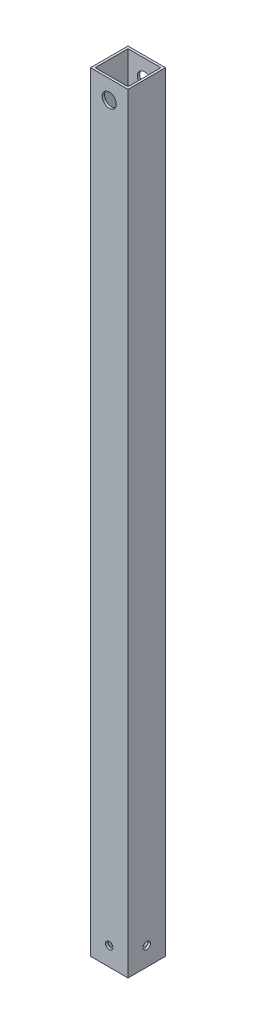
ISO-10303-21;
HEADER;
FILE_DESCRIPTION(('STEP AP214'),'2;1');
FILE_NAME('part.step','',(''),(''),'','','');
FILE_SCHEMA(('AUTOMOTIVE_DESIGN { 1 0 10303 214 1 1 1 1 }'));
ENDSEC;
DATA;
#1=APPLICATION_CONTEXT('core data for automotive mechanical design processes');
#2=APPLICATION_PROTOCOL_DEFINITION('international standard','automotive_design',2000,#1);
#3=PRODUCT_CONTEXT('',#1,'mechanical');
#4=PRODUCT('Part','Part','',(#3));
#5=PRODUCT_RELATED_PRODUCT_CATEGORY('part','',(#4));
#6=PRODUCT_DEFINITION_FORMATION('','',#4);
#7=PRODUCT_DEFINITION_CONTEXT('part definition',#1,'design');
#8=PRODUCT_DEFINITION('design','',#6,#7);
#9=PRODUCT_DEFINITION_SHAPE('','',#8);
#10=(LENGTH_UNIT() NAMED_UNIT(*) SI_UNIT(.MILLI.,.METRE.));
#11=(NAMED_UNIT(*) PLANE_ANGLE_UNIT() SI_UNIT($,.RADIAN.));
#12=(NAMED_UNIT(*) SI_UNIT($,.STERADIAN.) SOLID_ANGLE_UNIT());
#13=UNCERTAINTY_MEASURE_WITH_UNIT(LENGTH_MEASURE(1.E-05),#10,'distance_accuracy_value','');
#14=(GEOMETRIC_REPRESENTATION_CONTEXT(3) GLOBAL_UNCERTAINTY_ASSIGNED_CONTEXT((#13)) GLOBAL_UNIT_ASSIGNED_CONTEXT((#10,
#11,#12)) REPRESENTATION_CONTEXT('',''));
#15=CARTESIAN_POINT('',(0.,0.,0.));
#16=DIRECTION('',(0.,0.,1.));
#17=DIRECTION('',(1.,0.,0.));
#18=AXIS2_PLACEMENT_3D('',#15,#16,#17);
#19=CARTESIAN_POINT('',(-12.7,-247.65,0.));
#20=DIRECTION('',(1.,0.,0.));
#21=DIRECTION('',(0.,0.,-1.));
#22=AXIS2_PLACEMENT_3D('',#19,#20,#21);
#23=CYLINDRICAL_SURFACE('',#22,2.4892);
#24=DIRECTION('',(1.,0.,0.));
#25=VECTOR('',#24,1.);
#26=CARTESIAN_POINT('',(-12.7,-247.65,2.4892));
#27=LINE('',#26,#25);
#28=CARTESIAN_POINT('',(11.1125,-247.65,2.4892));
#29=VERTEX_POINT('',#28);
#30=CARTESIAN_POINT('',(12.7,-247.65,2.4892));
#31=VERTEX_POINT('',#30);
#32=EDGE_CURVE('E142',#29,#31,#27,.T.);
#33=ORIENTED_EDGE('',*,*,#32,.F.);
#34=CARTESIAN_POINT('',(11.1125,-247.65,0.));
#35=DIRECTION('',(-1.,0.,0.));
#36=DIRECTION('',(0.,0.,1.));
#37=AXIS2_PLACEMENT_3D('',#34,#35,#36);
#38=CIRCLE('',#37,2.4892);
#39=CARTESIAN_POINT('',(11.1125,-247.65,-2.4892));
#40=VERTEX_POINT('',#39);
#41=EDGE_CURVE('E132',#29,#40,#38,.T.);
#42=ORIENTED_EDGE('',*,*,#41,.T.);
#43=DIRECTION('',(1.,0.,0.));
#44=VECTOR('',#43,1.);
#45=CARTESIAN_POINT('',(-12.7,-247.65,-2.4892));
#46=LINE('',#45,#44);
#47=CARTESIAN_POINT('',(12.7,-247.65,-2.4892));
#48=VERTEX_POINT('',#47);
#49=EDGE_CURVE('E163',#40,#48,#46,.T.);
#50=ORIENTED_EDGE('',*,*,#49,.T.);
#51=CARTESIAN_POINT('',(12.7,-247.65,0.));
#52=DIRECTION('',(1.,0.,0.));
#53=DIRECTION('',(0.,0.,-1.));
#54=AXIS2_PLACEMENT_3D('',#51,#52,#53);
#55=CIRCLE('',#54,2.4892);
#56=EDGE_CURVE('E233',#48,#31,#55,.T.);
#57=ORIENTED_EDGE('',*,*,#56,.T.);
#58=EDGE_LOOP('',(#33,#42,#50,#57));
#59=FACE_BOUND('',#58,.T.);
#60=ADVANCED_FACE('F17',(#59),#23,.F.);
#61=CARTESIAN_POINT('',(-12.7,-247.65,0.));
#62=DIRECTION('',(1.,0.,0.));
#63=DIRECTION('',(0.,0.,-1.));
#64=AXIS2_PLACEMENT_3D('',#61,#62,#63);
#65=CYLINDRICAL_SURFACE('',#64,2.4892);
#66=DIRECTION('',(1.,0.,0.));
#67=VECTOR('',#66,1.);
#68=CARTESIAN_POINT('',(-12.7,-247.65,2.4892));
#69=LINE('',#68,#67);
#70=CARTESIAN_POINT('',(-12.7,-247.65,2.4892));
#71=VERTEX_POINT('',#70);
#72=CARTESIAN_POINT('',(-11.1125,-247.65,2.4892));
#73=VERTEX_POINT('',#72);
#74=EDGE_CURVE('E162',#71,#73,#69,.T.);
#75=ORIENTED_EDGE('',*,*,#74,.F.);
#76=CARTESIAN_POINT('',(-12.7,-247.65,0.));
#77=DIRECTION('',(1.,0.,0.));
#78=DIRECTION('',(0.,0.,-1.));
#79=AXIS2_PLACEMENT_3D('',#76,#77,#78);
#80=CIRCLE('',#79,2.4892);
#81=CARTESIAN_POINT('',(-12.7,-247.65,-2.4892));
#82=VERTEX_POINT('',#81);
#83=EDGE_CURVE('E219',#82,#71,#80,.T.);
#84=ORIENTED_EDGE('',*,*,#83,.F.);
#85=DIRECTION('',(1.,0.,0.));
#86=VECTOR('',#85,1.);
#87=CARTESIAN_POINT('',(-12.7,-247.65,-2.4892));
#88=LINE('',#87,#86);
#89=CARTESIAN_POINT('',(-11.1125,-247.65,-2.4892));
#90=VERTEX_POINT('',#89);
#91=EDGE_CURVE('E164',#82,#90,#88,.T.);
#92=ORIENTED_EDGE('',*,*,#91,.T.);
#93=CARTESIAN_POINT('',(-11.1125,-247.65,0.));
#94=DIRECTION('',(1.,0.,0.));
#95=DIRECTION('',(0.,0.,-1.));
#96=AXIS2_PLACEMENT_3D('',#93,#94,#95);
#97=CIRCLE('',#96,2.4892);
#98=EDGE_CURVE('E157',#90,#73,#97,.T.);
#99=ORIENTED_EDGE('',*,*,#98,.T.);
#100=EDGE_LOOP('',(#75,#84,#92,#99));
#101=FACE_BOUND('',#100,.T.);
#102=ADVANCED_FACE('F448',(#101),#65,.F.);
#103=CARTESIAN_POINT('',(0.,-247.65,-12.7));
#104=DIRECTION('',(0.,0.,1.));
#105=DIRECTION('',(1.,0.,0.));
#106=AXIS2_PLACEMENT_3D('',#103,#104,#105);
#107=CYLINDRICAL_SURFACE('',#106,2.4892);
#108=DIRECTION('',(0.,0.,1.));
#109=VECTOR('',#108,1.);
#110=CARTESIAN_POINT('',(-2.4892,-247.65,-12.7));
#111=LINE('',#110,#109);
#112=CARTESIAN_POINT('',(-2.4892,-247.65,-12.7));
#113=VERTEX_POINT('',#112);
#114=CARTESIAN_POINT('',(-2.4892,-247.65,-11.1125));
#115=VERTEX_POINT('',#114);
#116=EDGE_CURVE('E185',#113,#115,#111,.T.);
#117=ORIENTED_EDGE('',*,*,#116,.F.);
#118=CARTESIAN_POINT('',(0.,-247.65,-12.7));
#119=DIRECTION('',(0.,0.,1.));
#120=DIRECTION('',(1.,0.,0.));
#121=AXIS2_PLACEMENT_3D('',#118,#119,#120);
#122=CIRCLE('',#121,2.4892);
#123=CARTESIAN_POINT('',(2.4892,-247.65,-12.7));
#124=VERTEX_POINT('',#123);
#125=EDGE_CURVE('E104',#124,#113,#122,.T.);
#126=ORIENTED_EDGE('',*,*,#125,.F.);
#127=DIRECTION('',(0.,0.,1.));
#128=VECTOR('',#127,1.);
#129=CARTESIAN_POINT('',(2.4892,-247.65,-12.7));
#130=LINE('',#129,#128);
#131=CARTESIAN_POINT('',(2.4892,-247.65,-11.1125));
#132=VERTEX_POINT('',#131);
#133=EDGE_CURVE('E119',#124,#132,#130,.T.);
#134=ORIENTED_EDGE('',*,*,#133,.T.);
#135=CARTESIAN_POINT('',(0.,-247.65,-11.1125));
#136=DIRECTION('',(0.,0.,1.));
#137=DIRECTION('',(1.,0.,0.));
#138=AXIS2_PLACEMENT_3D('',#135,#136,#137);
#139=CIRCLE('',#138,2.4892);
#140=EDGE_CURVE('E179',#132,#115,#139,.T.);
#141=ORIENTED_EDGE('',*,*,#140,.T.);
#142=EDGE_LOOP('',(#117,#126,#134,#141));
#143=FACE_BOUND('',#142,.T.);
#144=ADVANCED_FACE('F477',(#143),#107,.F.);
#145=CARTESIAN_POINT('',(0.,247.65,-12.7));
#146=DIRECTION('',(0.,0.,1.));
#147=DIRECTION('',(1.,0.,0.));
#148=AXIS2_PLACEMENT_3D('',#145,#146,#147);
#149=CYLINDRICAL_SURFACE('',#148,4.7625);
#150=DIRECTION('',(0.,0.,1.));
#151=VECTOR('',#150,1.);
#152=CARTESIAN_POINT('',(-4.7625,247.65,-12.7));
#153=LINE('',#152,#151);
#154=CARTESIAN_POINT('',(-4.7625,247.65,-12.7));
#155=VERTEX_POINT('',#154);
#156=CARTESIAN_POINT('',(-4.7625,247.65,-11.1125));
#157=VERTEX_POINT('',#156);
#158=EDGE_CURVE('E108',#155,#157,#153,.T.);
#159=ORIENTED_EDGE('',*,*,#158,.F.);
#160=CARTESIAN_POINT('',(0.,247.65,-12.7));
#161=DIRECTION('',(0.,0.,1.));
#162=DIRECTION('',(1.,0.,0.));
#163=AXIS2_PLACEMENT_3D('',#160,#161,#162);
#164=CIRCLE('',#163,4.7625);
#165=CARTESIAN_POINT('',(4.7625,247.65,-12.7));
#166=VERTEX_POINT('',#165);
#167=EDGE_CURVE('E93',#166,#155,#164,.T.);
#168=ORIENTED_EDGE('',*,*,#167,.F.);
#169=DIRECTION('',(0.,0.,1.));
#170=VECTOR('',#169,1.);
#171=CARTESIAN_POINT('',(4.7625,247.65,-12.7));
#172=LINE('',#171,#170);
#173=CARTESIAN_POINT('',(4.7625,247.65,-11.1125));
#174=VERTEX_POINT('',#173);
#175=EDGE_CURVE('E117',#166,#174,#172,.T.);
#176=ORIENTED_EDGE('',*,*,#175,.T.);
#177=CARTESIAN_POINT('',(0.,247.65,-11.1125));
#178=DIRECTION('',(0.,0.,1.));
#179=DIRECTION('',(1.,0.,0.));
#180=AXIS2_PLACEMENT_3D('',#177,#178,#179);
#181=CIRCLE('',#180,4.7625);
#182=EDGE_CURVE('E109',#174,#157,#181,.T.);
#183=ORIENTED_EDGE('',*,*,#182,.T.);
#184=EDGE_LOOP('',(#159,#168,#176,#183));
#185=FACE_BOUND('',#184,.T.);
#186=ADVANCED_FACE('F19',(#185),#149,.F.);
#187=CARTESIAN_POINT('',(0.,-247.65,-12.7));
#188=DIRECTION('',(0.,0.,1.));
#189=DIRECTION('',(1.,0.,0.));
#190=AXIS2_PLACEMENT_3D('',#187,#188,#189);
#191=CYLINDRICAL_SURFACE('',#190,2.4892);
#192=DIRECTION('',(0.,0.,1.));
#193=VECTOR('',#192,1.);
#194=CARTESIAN_POINT('',(-2.4892,-247.65,-12.7));
#195=LINE('',#194,#193);
#196=CARTESIAN_POINT('',(-2.4892,-247.65,11.1125));
#197=VERTEX_POINT('',#196);
#198=CARTESIAN_POINT('',(-2.4892,-247.65,12.7));
#199=VERTEX_POINT('',#198);
#200=EDGE_CURVE('E305',#197,#199,#195,.T.);
#201=ORIENTED_EDGE('',*,*,#200,.F.);
#202=CARTESIAN_POINT('',(0.,-247.65,11.1125));
#203=DIRECTION('',(0.,0.,-1.));
#204=DIRECTION('',(-1.,0.,0.));
#205=AXIS2_PLACEMENT_3D('',#202,#203,#204);
#206=CIRCLE('',#205,2.4892);
#207=CARTESIAN_POINT('',(2.4892,-247.65,11.1125));
#208=VERTEX_POINT('',#207);
#209=EDGE_CURVE('E28',#197,#208,#206,.T.);
#210=ORIENTED_EDGE('',*,*,#209,.T.);
#211=DIRECTION('',(0.,0.,1.));
#212=VECTOR('',#211,1.);
#213=CARTESIAN_POINT('',(2.4892,-247.65,-12.7));
#214=LINE('',#213,#212);
#215=CARTESIAN_POINT('',(2.4892,-247.65,12.7));
#216=VERTEX_POINT('',#215);
#217=EDGE_CURVE('E200',#208,#216,#214,.T.);
#218=ORIENTED_EDGE('',*,*,#217,.T.);
#219=CARTESIAN_POINT('',(0.,-247.65,12.7));
#220=DIRECTION('',(0.,0.,-1.));
#221=DIRECTION('',(-1.,0.,0.));
#222=AXIS2_PLACEMENT_3D('',#219,#220,#221);
#223=CIRCLE('',#222,2.4892);
#224=EDGE_CURVE('E220',#199,#216,#223,.T.);
#225=ORIENTED_EDGE('',*,*,#224,.F.);
#226=EDGE_LOOP('',(#201,#210,#218,#225));
#227=FACE_BOUND('',#226,.T.);
#228=ADVANCED_FACE('F525',(#227),#191,.F.);
#229=CARTESIAN_POINT('',(0.,247.65,-12.7));
#230=DIRECTION('',(0.,0.,1.));
#231=DIRECTION('',(1.,0.,0.));
#232=AXIS2_PLACEMENT_3D('',#229,#230,#231);
#233=CYLINDRICAL_SURFACE('',#232,4.7625);
#234=DIRECTION('',(0.,0.,1.));
#235=VECTOR('',#234,1.);
#236=CARTESIAN_POINT('',(-4.7625,247.65,-12.7));
#237=LINE('',#236,#235);
#238=CARTESIAN_POINT('',(-4.7625,247.65,11.1125));
#239=VERTEX_POINT('',#238);
#240=CARTESIAN_POINT('',(-4.7625,247.65,12.7));
#241=VERTEX_POINT('',#240);
#242=EDGE_CURVE('E238',#239,#241,#237,.T.);
#243=ORIENTED_EDGE('',*,*,#242,.F.);
#244=CARTESIAN_POINT('',(0.,247.65,11.1125));
#245=DIRECTION('',(0.,0.,-1.));
#246=DIRECTION('',(-1.,0.,0.));
#247=AXIS2_PLACEMENT_3D('',#244,#245,#246);
#248=CIRCLE('',#247,4.7625);
#249=CARTESIAN_POINT('',(4.7625,247.65,11.1125));
#250=VERTEX_POINT('',#249);
#251=EDGE_CURVE('E11',#239,#250,#248,.T.);
#252=ORIENTED_EDGE('',*,*,#251,.T.);
#253=DIRECTION('',(0.,0.,1.));
#254=VECTOR('',#253,1.);
#255=CARTESIAN_POINT('',(4.7625,247.65,-12.7));
#256=LINE('',#255,#254);
#257=CARTESIAN_POINT('',(4.7625,247.65,12.7));
#258=VERTEX_POINT('',#257);
#259=EDGE_CURVE('E148',#250,#258,#256,.T.);
#260=ORIENTED_EDGE('',*,*,#259,.T.);
#261=CARTESIAN_POINT('',(0.,247.65,12.7));
#262=DIRECTION('',(0.,0.,-1.));
#263=DIRECTION('',(-1.,0.,0.));
#264=AXIS2_PLACEMENT_3D('',#261,#262,#263);
#265=CIRCLE('',#264,4.7625);
#266=EDGE_CURVE('E224',#241,#258,#265,.T.);
#267=ORIENTED_EDGE('',*,*,#266,.F.);
#268=EDGE_LOOP('',(#243,#252,#260,#267));
#269=FACE_BOUND('',#268,.T.);
#270=ADVANCED_FACE('F518',(#269),#233,.F.);
#271=CARTESIAN_POINT('',(0.,260.35,11.1125));
#272=DIRECTION('',(0.,0.,-1.));
#273=DIRECTION('',(-1.,0.,0.));
#274=AXIS2_PLACEMENT_3D('',#271,#272,#273);
#275=PLANE('',#274);
#276=CARTESIAN_POINT('',(0.,247.65,11.1125));
#277=DIRECTION('',(0.,0.,-1.));
#278=DIRECTION('',(-1.,0.,0.));
#279=AXIS2_PLACEMENT_3D('',#276,#277,#278);
#280=CIRCLE('',#279,4.7625);
#281=EDGE_CURVE('E204',#250,#239,#280,.T.);
#282=ORIENTED_EDGE('',*,*,#281,.F.);
#283=ORIENTED_EDGE('',*,*,#251,.F.);
#284=EDGE_LOOP('',(#282,#283));
#285=FACE_BOUND('',#284,.T.);
#286=CARTESIAN_POINT('',(0.,-247.65,11.1125));
#287=DIRECTION('',(0.,0.,-1.));
#288=DIRECTION('',(-1.,0.,0.));
#289=AXIS2_PLACEMENT_3D('',#286,#287,#288);
#290=CIRCLE('',#289,2.4892);
#291=EDGE_CURVE('E300',#208,#197,#290,.T.);
#292=ORIENTED_EDGE('',*,*,#291,.F.);
#293=ORIENTED_EDGE('',*,*,#209,.F.);
#294=EDGE_LOOP('',(#292,#293));
#295=FACE_BOUND('',#294,.T.);
#296=DIRECTION('',(1.,0.,0.));
#297=VECTOR('',#296,1.);
#298=CARTESIAN_POINT('',(0.,-260.35,11.1125));
#299=LINE('',#298,#297);
#300=CARTESIAN_POINT('',(-11.1125,-260.35,11.1125));
#301=VERTEX_POINT('',#300);
#302=CARTESIAN_POINT('',(11.1125,-260.35,11.1125));
#303=VERTEX_POINT('',#302);
#304=EDGE_CURVE('E177',#301,#303,#299,.T.);
#305=ORIENTED_EDGE('',*,*,#304,.F.);
#306=DIRECTION('',(0.,-1.,0.));
#307=VECTOR('',#306,1.);
#308=CARTESIAN_POINT('',(-11.1125,260.35,11.1125));
#309=LINE('',#308,#307);
#310=CARTESIAN_POINT('',(-11.1125,260.35,11.1125));
#311=VERTEX_POINT('',#310);
#312=EDGE_CURVE('E43',#311,#301,#309,.T.);
#313=ORIENTED_EDGE('',*,*,#312,.F.);
#314=DIRECTION('',(1.,0.,0.));
#315=VECTOR('',#314,1.);
#316=CARTESIAN_POINT('',(0.,260.35,11.1125));
#317=LINE('',#316,#315);
#318=CARTESIAN_POINT('',(11.1125,260.35,11.1125));
#319=VERTEX_POINT('',#318);
#320=EDGE_CURVE('E147',#311,#319,#317,.T.);
#321=ORIENTED_EDGE('',*,*,#320,.T.);
#322=DIRECTION('',(0.,-1.,0.));
#323=VECTOR('',#322,1.);
#324=CARTESIAN_POINT('',(11.1125,260.35,11.1125));
#325=LINE('',#324,#323);
#326=EDGE_CURVE('E225',#319,#303,#325,.T.);
#327=ORIENTED_EDGE('',*,*,#326,.T.);
#328=EDGE_LOOP('',(#305,#313,#321,#327));
#329=FACE_BOUND('',#328,.T.);
#330=ADVANCED_FACE('F504',(#285,#295,#329),#275,.T.);
#331=CARTESIAN_POINT('',(-11.1125,260.35,0.));
#332=DIRECTION('',(1.,0.,0.));
#333=DIRECTION('',(0.,0.,1.));
#334=AXIS2_PLACEMENT_3D('',#331,#332,#333);
#335=PLANE('',#334);
#336=ORIENTED_EDGE('',*,*,#98,.F.);
#337=CARTESIAN_POINT('',(-11.1125,-247.65,0.));
#338=DIRECTION('',(1.,0.,0.));
#339=DIRECTION('',(0.,0.,-1.));
#340=AXIS2_PLACEMENT_3D('',#337,#338,#339);
#341=CIRCLE('',#340,2.4892);
#342=EDGE_CURVE('E169',#73,#90,#341,.T.);
#343=ORIENTED_EDGE('',*,*,#342,.F.);
#344=EDGE_LOOP('',(#336,#343));
#345=FACE_BOUND('',#344,.T.);
#346=DIRECTION('',(0.,0.,1.));
#347=VECTOR('',#346,1.);
#348=CARTESIAN_POINT('',(-11.1125,-260.35,0.));
#349=LINE('',#348,#347);
#350=CARTESIAN_POINT('',(-11.1125,-260.35,-11.1125));
#351=VERTEX_POINT('',#350);
#352=EDGE_CURVE('E173',#351,#301,#349,.T.);
#353=ORIENTED_EDGE('',*,*,#352,.F.);
#354=DIRECTION('',(0.,-1.,0.));
#355=VECTOR('',#354,1.);
#356=CARTESIAN_POINT('',(-11.1125,260.35,-11.1125));
#357=LINE('',#356,#355);
#358=CARTESIAN_POINT('',(-11.1125,260.35,-11.1125));
#359=VERTEX_POINT('',#358);
#360=EDGE_CURVE('E136',#359,#351,#357,.T.);
#361=ORIENTED_EDGE('',*,*,#360,.F.);
#362=DIRECTION('',(0.,0.,1.));
#363=VECTOR('',#362,1.);
#364=CARTESIAN_POINT('',(-11.1125,260.35,0.));
#365=LINE('',#364,#363);
#366=EDGE_CURVE('E143',#359,#311,#365,.T.);
#367=ORIENTED_EDGE('',*,*,#366,.T.);
#368=ORIENTED_EDGE('',*,*,#312,.T.);
#369=EDGE_LOOP('',(#353,#361,#367,#368));
#370=FACE_BOUND('',#369,.T.);
#371=ADVANCED_FACE('F500',(#345,#370),#335,.T.);
#372=CARTESIAN_POINT('',(0.,260.35,-11.1125));
#373=DIRECTION('',(0.,0.,1.));
#374=DIRECTION('',(1.,0.,0.));
#375=AXIS2_PLACEMENT_3D('',#372,#373,#374);
#376=PLANE('',#375);
#377=ORIENTED_EDGE('',*,*,#182,.F.);
#378=CARTESIAN_POINT('',(0.,247.65,-11.1125));
#379=DIRECTION('',(0.,0.,1.));
#380=DIRECTION('',(1.,0.,0.));
#381=AXIS2_PLACEMENT_3D('',#378,#379,#380);
#382=CIRCLE('',#381,4.7625);
#383=EDGE_CURVE('E114',#157,#174,#382,.T.);
#384=ORIENTED_EDGE('',*,*,#383,.F.);
#385=EDGE_LOOP('',(#377,#384));
#386=FACE_BOUND('',#385,.T.);
#387=ORIENTED_EDGE('',*,*,#140,.F.);
#388=CARTESIAN_POINT('',(0.,-247.65,-11.1125));
#389=DIRECTION('',(0.,0.,1.));
#390=DIRECTION('',(1.,0.,0.));
#391=AXIS2_PLACEMENT_3D('',#388,#389,#390);
#392=CIRCLE('',#391,2.4892);
#393=EDGE_CURVE('E126',#115,#132,#392,.T.);
#394=ORIENTED_EDGE('',*,*,#393,.F.);
#395=EDGE_LOOP('',(#387,#394));
#396=FACE_BOUND('',#395,.T.);
#397=DIRECTION('',(-1.,0.,0.));
#398=VECTOR('',#397,1.);
#399=CARTESIAN_POINT('',(0.,-260.35,-11.1125));
#400=LINE('',#399,#398);
#401=CARTESIAN_POINT('',(11.1125,-260.35,-11.1125));
#402=VERTEX_POINT('',#401);
#403=EDGE_CURVE('E130',#402,#351,#400,.T.);
#404=ORIENTED_EDGE('',*,*,#403,.F.);
#405=DIRECTION('',(0.,-1.,0.));
#406=VECTOR('',#405,1.);
#407=CARTESIAN_POINT('',(11.1125,260.35,-11.1125));
#408=LINE('',#407,#406);
#409=CARTESIAN_POINT('',(11.1125,260.35,-11.1125));
#410=VERTEX_POINT('',#409);
#411=EDGE_CURVE('E137',#410,#402,#408,.T.);
#412=ORIENTED_EDGE('',*,*,#411,.F.);
#413=DIRECTION('',(-1.,0.,0.));
#414=VECTOR('',#413,1.);
#415=CARTESIAN_POINT('',(0.,260.35,-11.1125));
#416=LINE('',#415,#414);
#417=EDGE_CURVE('E198',#410,#359,#416,.T.);
#418=ORIENTED_EDGE('',*,*,#417,.T.);
#419=ORIENTED_EDGE('',*,*,#360,.T.);
#420=EDGE_LOOP('',(#404,#412,#418,#419));
#421=FACE_BOUND('',#420,.T.);
#422=ADVANCED_FACE('F503',(#386,#396,#421),#376,.T.);
#423=CARTESIAN_POINT('',(11.1125,260.35,0.));
#424=DIRECTION('',(-1.,0.,0.));
#425=DIRECTION('',(0.,0.,1.));
#426=AXIS2_PLACEMENT_3D('',#423,#424,#425);
#427=PLANE('',#426);
#428=CARTESIAN_POINT('',(11.1125,-247.65,0.));
#429=DIRECTION('',(-1.,0.,0.));
#430=DIRECTION('',(0.,0.,1.));
#431=AXIS2_PLACEMENT_3D('',#428,#429,#430);
#432=CIRCLE('',#431,2.4892);
#433=EDGE_CURVE('E138',#40,#29,#432,.T.);
#434=ORIENTED_EDGE('',*,*,#433,.F.);
#435=ORIENTED_EDGE('',*,*,#41,.F.);
#436=EDGE_LOOP('',(#434,#435));
#437=FACE_BOUND('',#436,.T.);
#438=DIRECTION('',(0.,0.,-1.));
#439=VECTOR('',#438,1.);
#440=CARTESIAN_POINT('',(11.1125,-260.35,0.));
#441=LINE('',#440,#439);
#442=EDGE_CURVE('E264',#303,#402,#441,.T.);
#443=ORIENTED_EDGE('',*,*,#442,.F.);
#444=ORIENTED_EDGE('',*,*,#326,.F.);
#445=DIRECTION('',(0.,0.,-1.));
#446=VECTOR('',#445,1.);
#447=CARTESIAN_POINT('',(11.1125,260.35,0.));
#448=LINE('',#447,#446);
#449=EDGE_CURVE('E195',#319,#410,#448,.T.);
#450=ORIENTED_EDGE('',*,*,#449,.T.);
#451=ORIENTED_EDGE('',*,*,#411,.T.);
#452=EDGE_LOOP('',(#443,#444,#450,#451));
#453=FACE_BOUND('',#452,.T.);
#454=ADVANCED_FACE('F465',(#437,#453),#427,.T.);
#455=CARTESIAN_POINT('',(-12.7,260.35,12.7));
#456=DIRECTION('',(0.,0.,-1.));
#457=DIRECTION('',(-1.,0.,0.));
#458=AXIS2_PLACEMENT_3D('',#455,#456,#457);
#459=PLANE('',#458);
#460=CARTESIAN_POINT('',(0.,247.65,12.7));
#461=DIRECTION('',(0.,0.,-1.));
#462=DIRECTION('',(-1.,0.,0.));
#463=AXIS2_PLACEMENT_3D('',#460,#461,#462);
#464=CIRCLE('',#463,4.7625);
#465=EDGE_CURVE('E153',#258,#241,#464,.T.);
#466=ORIENTED_EDGE('',*,*,#465,.T.);
#467=ORIENTED_EDGE('',*,*,#266,.T.);
#468=EDGE_LOOP('',(#466,#467));
#469=FACE_BOUND('',#468,.T.);
#470=CARTESIAN_POINT('',(0.,-247.65,12.7));
#471=DIRECTION('',(0.,0.,-1.));
#472=DIRECTION('',(-1.,0.,0.));
#473=AXIS2_PLACEMENT_3D('',#470,#471,#472);
#474=CIRCLE('',#473,2.4892);
#475=EDGE_CURVE('E21',#216,#199,#474,.T.);
#476=ORIENTED_EDGE('',*,*,#475,.T.);
#477=ORIENTED_EDGE('',*,*,#224,.T.);
#478=EDGE_LOOP('',(#476,#477));
#479=FACE_BOUND('',#478,.T.);
#480=DIRECTION('',(1.,0.,0.));
#481=VECTOR('',#480,1.);
#482=CARTESIAN_POINT('',(-12.7,-260.35,12.7));
#483=LINE('',#482,#481);
#484=CARTESIAN_POINT('',(-12.7,-260.35,12.7));
#485=VERTEX_POINT('',#484);
#486=CARTESIAN_POINT('',(12.7,-260.35,12.7));
#487=VERTEX_POINT('',#486);
#488=EDGE_CURVE('E205',#485,#487,#483,.T.);
#489=ORIENTED_EDGE('',*,*,#488,.T.);
#490=DIRECTION('',(0.,-1.,0.));
#491=VECTOR('',#490,1.);
#492=CARTESIAN_POINT('',(12.7,260.35,12.7));
#493=LINE('',#492,#491);
#494=CARTESIAN_POINT('',(12.7,260.35,12.7));
#495=VERTEX_POINT('',#494);
#496=EDGE_CURVE('E251',#495,#487,#493,.T.);
#497=ORIENTED_EDGE('',*,*,#496,.F.);
#498=DIRECTION('',(1.,0.,0.));
#499=VECTOR('',#498,1.);
#500=CARTESIAN_POINT('',(-12.7,260.35,12.7));
#501=LINE('',#500,#499);
#502=CARTESIAN_POINT('',(-12.7,260.35,12.7));
#503=VERTEX_POINT('',#502);
#504=EDGE_CURVE('E247',#503,#495,#501,.T.);
#505=ORIENTED_EDGE('',*,*,#504,.F.);
#506=DIRECTION('',(0.,-1.,0.));
#507=VECTOR('',#506,1.);
#508=CARTESIAN_POINT('',(-12.7,260.35,12.7));
#509=LINE('',#508,#507);
#510=EDGE_CURVE('E103',#503,#485,#509,.T.);
#511=ORIENTED_EDGE('',*,*,#510,.T.);
#512=EDGE_LOOP('',(#489,#497,#505,#511));
#513=FACE_BOUND('',#512,.T.);
#514=ADVANCED_FACE('F455',(#469,#479,#513),#459,.F.);
#515=CARTESIAN_POINT('',(-12.7,260.35,12.7));
#516=DIRECTION('',(1.,0.,0.));
#517=DIRECTION('',(0.,0.,1.));
#518=AXIS2_PLACEMENT_3D('',#515,#516,#517);
#519=PLANE('',#518);
#520=ORIENTED_EDGE('',*,*,#83,.T.);
#521=CARTESIAN_POINT('',(-12.7,-247.65,0.));
#522=DIRECTION('',(1.,0.,0.));
#523=DIRECTION('',(0.,0.,-1.));
#524=AXIS2_PLACEMENT_3D('',#521,#522,#523);
#525=CIRCLE('',#524,2.4892);
#526=EDGE_CURVE('E158',#71,#82,#525,.T.);
#527=ORIENTED_EDGE('',*,*,#526,.T.);
#528=EDGE_LOOP('',(#520,#527));
#529=FACE_BOUND('',#528,.T.);
#530=DIRECTION('',(0.,0.,1.));
#531=VECTOR('',#530,1.);
#532=CARTESIAN_POINT('',(-12.7,-260.35,12.7));
#533=LINE('',#532,#531);
#534=CARTESIAN_POINT('',(-12.7,-260.35,-12.7));
#535=VERTEX_POINT('',#534);
#536=EDGE_CURVE('E209',#535,#485,#533,.T.);
#537=ORIENTED_EDGE('',*,*,#536,.T.);
#538=ORIENTED_EDGE('',*,*,#510,.F.);
#539=DIRECTION('',(0.,0.,1.));
#540=VECTOR('',#539,1.);
#541=CARTESIAN_POINT('',(-12.7,260.35,12.7));
#542=LINE('',#541,#540);
#543=CARTESIAN_POINT('',(-12.7,260.35,-12.7));
#544=VERTEX_POINT('',#543);
#545=EDGE_CURVE('E191',#544,#503,#542,.T.);
#546=ORIENTED_EDGE('',*,*,#545,.F.);
#547=DIRECTION('',(0.,-1.,0.));
#548=VECTOR('',#547,1.);
#549=CARTESIAN_POINT('',(-12.7,260.35,-12.7));
#550=LINE('',#549,#548);
#551=EDGE_CURVE('E229',#544,#535,#550,.T.);
#552=ORIENTED_EDGE('',*,*,#551,.T.);
#553=EDGE_LOOP('',(#537,#538,#546,#552));
#554=FACE_BOUND('',#553,.T.);
#555=ADVANCED_FACE('F353',(#529,#554),#519,.F.);
#556=CARTESIAN_POINT('',(-12.7,260.35,-12.7));
#557=DIRECTION('',(0.,0.,1.));
#558=DIRECTION('',(1.,0.,0.));
#559=AXIS2_PLACEMENT_3D('',#556,#557,#558);
#560=PLANE('',#559);
#561=ORIENTED_EDGE('',*,*,#167,.T.);
#562=CARTESIAN_POINT('',(0.,247.65,-12.7));
#563=DIRECTION('',(0.,0.,1.));
#564=DIRECTION('',(1.,0.,0.));
#565=AXIS2_PLACEMENT_3D('',#562,#563,#564);
#566=CIRCLE('',#565,4.7625);
#567=EDGE_CURVE('E98',#155,#166,#566,.T.);
#568=ORIENTED_EDGE('',*,*,#567,.T.);
#569=EDGE_LOOP('',(#561,#568));
#570=FACE_BOUND('',#569,.T.);
#571=ORIENTED_EDGE('',*,*,#125,.T.);
#572=CARTESIAN_POINT('',(0.,-247.65,-12.7));
#573=DIRECTION('',(0.,0.,1.));
#574=DIRECTION('',(1.,0.,0.));
#575=AXIS2_PLACEMENT_3D('',#572,#573,#574);
#576=CIRCLE('',#575,2.4892);
#577=EDGE_CURVE('E168',#113,#124,#576,.T.);
#578=ORIENTED_EDGE('',*,*,#577,.T.);
#579=EDGE_LOOP('',(#571,#578));
#580=FACE_BOUND('',#579,.T.);
#581=DIRECTION('',(-1.,0.,0.));
#582=VECTOR('',#581,1.);
#583=CARTESIAN_POINT('',(-12.7,-260.35,-12.7));
#584=LINE('',#583,#582);
#585=CARTESIAN_POINT('',(12.7,-260.35,-12.7));
#586=VERTEX_POINT('',#585);
#587=EDGE_CURVE('E268',#586,#535,#584,.T.);
#588=ORIENTED_EDGE('',*,*,#587,.T.);
#589=ORIENTED_EDGE('',*,*,#551,.F.);
#590=DIRECTION('',(-1.,0.,0.));
#591=VECTOR('',#590,1.);
#592=CARTESIAN_POINT('',(-12.7,260.35,-12.7));
#593=LINE('',#592,#591);
#594=CARTESIAN_POINT('',(12.7,260.35,-12.7));
#595=VERTEX_POINT('',#594);
#596=EDGE_CURVE('E187',#595,#544,#593,.T.);
#597=ORIENTED_EDGE('',*,*,#596,.F.);
#598=DIRECTION('',(0.,-1.,0.));
#599=VECTOR('',#598,1.);
#600=CARTESIAN_POINT('',(12.7,260.35,-12.7));
#601=LINE('',#600,#599);
#602=EDGE_CURVE('E255',#595,#586,#601,.T.);
#603=ORIENTED_EDGE('',*,*,#602,.T.);
#604=EDGE_LOOP('',(#588,#589,#597,#603));
#605=FACE_BOUND('',#604,.T.);
#606=ADVANCED_FACE('F95',(#570,#580,#605),#560,.F.);
#607=CARTESIAN_POINT('',(12.7,260.35,12.7));
#608=DIRECTION('',(-1.,0.,0.));
#609=DIRECTION('',(0.,0.,1.));
#610=AXIS2_PLACEMENT_3D('',#607,#608,#609);
#611=PLANE('',#610);
#612=ORIENTED_EDGE('',*,*,#56,.F.);
#613=CARTESIAN_POINT('',(12.7,-247.65,0.));
#614=DIRECTION('',(1.,0.,0.));
#615=DIRECTION('',(0.,0.,-1.));
#616=AXIS2_PLACEMENT_3D('',#613,#614,#615);
#617=CIRCLE('',#616,2.4892);
#618=EDGE_CURVE('E237',#31,#48,#617,.T.);
#619=ORIENTED_EDGE('',*,*,#618,.F.);
#620=EDGE_LOOP('',(#612,#619));
#621=FACE_BOUND('',#620,.T.);
#622=DIRECTION('',(0.,0.,-1.));
#623=VECTOR('',#622,1.);
#624=CARTESIAN_POINT('',(12.7,-260.35,12.7));
#625=LINE('',#624,#623);
#626=EDGE_CURVE('E146',#487,#586,#625,.T.);
#627=ORIENTED_EDGE('',*,*,#626,.T.);
#628=ORIENTED_EDGE('',*,*,#602,.F.);
#629=DIRECTION('',(0.,0.,-1.));
#630=VECTOR('',#629,1.);
#631=CARTESIAN_POINT('',(12.7,260.35,12.7));
#632=LINE('',#631,#630);
#633=EDGE_CURVE('E152',#495,#595,#632,.T.);
#634=ORIENTED_EDGE('',*,*,#633,.F.);
#635=ORIENTED_EDGE('',*,*,#496,.T.);
#636=EDGE_LOOP('',(#627,#628,#634,#635));
#637=FACE_BOUND('',#636,.T.);
#638=ADVANCED_FACE('F463',(#621,#637),#611,.F.);
#639=CARTESIAN_POINT('',(0.,-260.35,0.));
#640=DIRECTION('',(0.,1.,0.));
#641=DIRECTION('',(1.,0.,0.));
#642=AXIS2_PLACEMENT_3D('',#639,#640,#641);
#643=PLANE('',#642);
#644=ORIENTED_EDGE('',*,*,#442,.T.);
#645=ORIENTED_EDGE('',*,*,#403,.T.);
#646=ORIENTED_EDGE('',*,*,#352,.T.);
#647=ORIENTED_EDGE('',*,*,#304,.T.);
#648=EDGE_LOOP('',(#644,#645,#646,#647));
#649=FACE_BOUND('',#648,.T.);
#650=ORIENTED_EDGE('',*,*,#626,.F.);
#651=ORIENTED_EDGE('',*,*,#488,.F.);
#652=ORIENTED_EDGE('',*,*,#536,.F.);
#653=ORIENTED_EDGE('',*,*,#587,.F.);
#654=EDGE_LOOP('',(#650,#651,#652,#653));
#655=FACE_BOUND('',#654,.T.);
#656=ADVANCED_FACE('F350',(#649,#655),#643,.F.);
#657=CARTESIAN_POINT('',(0.,260.35,0.));
#658=DIRECTION('',(0.,1.,0.));
#659=DIRECTION('',(1.,0.,0.));
#660=AXIS2_PLACEMENT_3D('',#657,#658,#659);
#661=PLANE('',#660);
#662=ORIENTED_EDGE('',*,*,#417,.F.);
#663=ORIENTED_EDGE('',*,*,#449,.F.);
#664=ORIENTED_EDGE('',*,*,#320,.F.);
#665=ORIENTED_EDGE('',*,*,#366,.F.);
#666=EDGE_LOOP('',(#662,#663,#664,#665));
#667=FACE_BOUND('',#666,.T.);
#668=ORIENTED_EDGE('',*,*,#633,.T.);
#669=ORIENTED_EDGE('',*,*,#596,.T.);
#670=ORIENTED_EDGE('',*,*,#545,.T.);
#671=ORIENTED_EDGE('',*,*,#504,.T.);
#672=EDGE_LOOP('',(#668,#669,#670,#671));
#673=FACE_BOUND('',#672,.T.);
#674=ADVANCED_FACE('F492',(#667,#673),#661,.T.);
#675=CARTESIAN_POINT('',(0.,247.65,-12.7));
#676=DIRECTION('',(0.,0.,1.));
#677=DIRECTION('',(1.,0.,0.));
#678=AXIS2_PLACEMENT_3D('',#675,#676,#677);
#679=CYLINDRICAL_SURFACE('',#678,4.7625);
#680=ORIENTED_EDGE('',*,*,#281,.T.);
#681=ORIENTED_EDGE('',*,*,#242,.T.);
#682=ORIENTED_EDGE('',*,*,#465,.F.);
#683=ORIENTED_EDGE('',*,*,#259,.F.);
#684=EDGE_LOOP('',(#680,#681,#682,#683));
#685=FACE_BOUND('',#684,.T.);
#686=ADVANCED_FACE('F489',(#685),#679,.F.);
#687=CARTESIAN_POINT('',(0.,-247.65,-12.7));
#688=DIRECTION('',(0.,0.,1.));
#689=DIRECTION('',(1.,0.,0.));
#690=AXIS2_PLACEMENT_3D('',#687,#688,#689);
#691=CYLINDRICAL_SURFACE('',#690,2.4892);
#692=ORIENTED_EDGE('',*,*,#291,.T.);
#693=ORIENTED_EDGE('',*,*,#200,.T.);
#694=ORIENTED_EDGE('',*,*,#475,.F.);
#695=ORIENTED_EDGE('',*,*,#217,.F.);
#696=EDGE_LOOP('',(#692,#693,#694,#695));
#697=FACE_BOUND('',#696,.T.);
#698=ADVANCED_FACE('F486',(#697),#691,.F.);
#699=CARTESIAN_POINT('',(0.,247.65,-12.7));
#700=DIRECTION('',(0.,0.,1.));
#701=DIRECTION('',(1.,0.,0.));
#702=AXIS2_PLACEMENT_3D('',#699,#700,#701);
#703=CYLINDRICAL_SURFACE('',#702,4.7625);
#704=ORIENTED_EDGE('',*,*,#567,.F.);
#705=ORIENTED_EDGE('',*,*,#158,.T.);
#706=ORIENTED_EDGE('',*,*,#383,.T.);
#707=ORIENTED_EDGE('',*,*,#175,.F.);
#708=EDGE_LOOP('',(#704,#705,#706,#707));
#709=FACE_BOUND('',#708,.T.);
#710=ADVANCED_FACE('F116',(#709),#703,.F.);
#711=CARTESIAN_POINT('',(0.,-247.65,-12.7));
#712=DIRECTION('',(0.,0.,1.));
#713=DIRECTION('',(1.,0.,0.));
#714=AXIS2_PLACEMENT_3D('',#711,#712,#713);
#715=CYLINDRICAL_SURFACE('',#714,2.4892);
#716=ORIENTED_EDGE('',*,*,#577,.F.);
#717=ORIENTED_EDGE('',*,*,#116,.T.);
#718=ORIENTED_EDGE('',*,*,#393,.T.);
#719=ORIENTED_EDGE('',*,*,#133,.F.);
#720=EDGE_LOOP('',(#716,#717,#718,#719));
#721=FACE_BOUND('',#720,.T.);
#722=ADVANCED_FACE('F482',(#721),#715,.F.);
#723=CARTESIAN_POINT('',(-12.7,-247.65,0.));
#724=DIRECTION('',(1.,0.,0.));
#725=DIRECTION('',(0.,0.,-1.));
#726=AXIS2_PLACEMENT_3D('',#723,#724,#725);
#727=CYLINDRICAL_SURFACE('',#726,2.4892);
#728=ORIENTED_EDGE('',*,*,#526,.F.);
#729=ORIENTED_EDGE('',*,*,#74,.T.);
#730=ORIENTED_EDGE('',*,*,#342,.T.);
#731=ORIENTED_EDGE('',*,*,#91,.F.);
#732=EDGE_LOOP('',(#728,#729,#730,#731));
#733=FACE_BOUND('',#732,.T.);
#734=ADVANCED_FACE('F452',(#733),#727,.F.);
#735=CARTESIAN_POINT('',(-12.7,-247.65,0.));
#736=DIRECTION('',(1.,0.,0.));
#737=DIRECTION('',(0.,0.,-1.));
#738=AXIS2_PLACEMENT_3D('',#735,#736,#737);
#739=CYLINDRICAL_SURFACE('',#738,2.4892);
#740=ORIENTED_EDGE('',*,*,#433,.T.);
#741=ORIENTED_EDGE('',*,*,#32,.T.);
#742=ORIENTED_EDGE('',*,*,#618,.T.);
#743=ORIENTED_EDGE('',*,*,#49,.F.);
#744=EDGE_LOOP('',(#740,#741,#742,#743));
#745=FACE_BOUND('',#744,.T.);
#746=ADVANCED_FACE('F499',(#745),#739,.F.);
#747=CLOSED_SHELL('',(#60,#102,#144,#186,#228,#270,#330,#371,#422,#454,#514,#555,#606,#638,#656,
#674,#686,#698,#710,#722,#734,#746));
#748=MANIFOLD_SOLID_BREP('B1',#747);
#749=ADVANCED_BREP_SHAPE_REPRESENTATION('',(#18,#748),#14);
#750=SHAPE_DEFINITION_REPRESENTATION(#9,#749);
ENDSEC;
END-ISO-10303-21;
